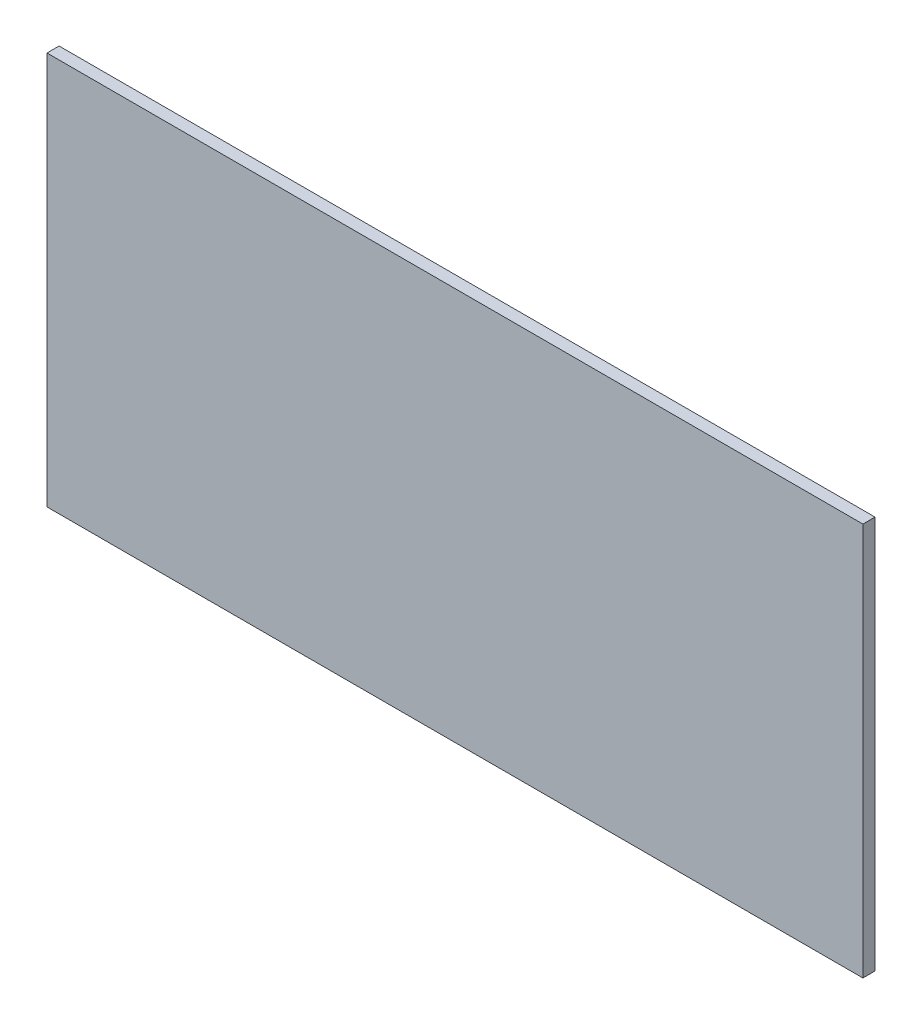
ISO-10303-21;
HEADER;
FILE_DESCRIPTION(('STEP AP214'),'2;1');
FILE_NAME('part.step','',(''),(''),'','','');
FILE_SCHEMA(('AUTOMOTIVE_DESIGN { 1 0 10303 214 1 1 1 1 }'));
ENDSEC;
DATA;
#1=APPLICATION_CONTEXT('core data for automotive mechanical design processes');
#2=APPLICATION_PROTOCOL_DEFINITION('international standard','automotive_design',2000,#1);
#3=PRODUCT_CONTEXT('',#1,'mechanical');
#4=PRODUCT('Part','Part','',(#3));
#5=PRODUCT_RELATED_PRODUCT_CATEGORY('part','',(#4));
#6=PRODUCT_DEFINITION_FORMATION('','',#4);
#7=PRODUCT_DEFINITION_CONTEXT('part definition',#1,'design');
#8=PRODUCT_DEFINITION('design','',#6,#7);
#9=PRODUCT_DEFINITION_SHAPE('','',#8);
#10=(LENGTH_UNIT() NAMED_UNIT(*) SI_UNIT(.MILLI.,.METRE.));
#11=(NAMED_UNIT(*) PLANE_ANGLE_UNIT() SI_UNIT($,.RADIAN.));
#12=(NAMED_UNIT(*) SI_UNIT($,.STERADIAN.) SOLID_ANGLE_UNIT());
#13=UNCERTAINTY_MEASURE_WITH_UNIT(LENGTH_MEASURE(1.E-05),#10,'distance_accuracy_value','');
#14=(GEOMETRIC_REPRESENTATION_CONTEXT(3) GLOBAL_UNCERTAINTY_ASSIGNED_CONTEXT((#13)) GLOBAL_UNIT_ASSIGNED_CONTEXT((#10,
#11,#12)) REPRESENTATION_CONTEXT('',''));
#15=CARTESIAN_POINT('',(0.,0.,0.));
#16=DIRECTION('',(0.,0.,1.));
#17=DIRECTION('',(1.,0.,0.));
#18=AXIS2_PLACEMENT_3D('',#15,#16,#17);
#19=CARTESIAN_POINT('',(101.,48.665,3.));
#20=DIRECTION('',(-1.,0.,0.));
#21=DIRECTION('',(0.,-1.,0.));
#22=AXIS2_PLACEMENT_3D('',#19,#20,#21);
#23=PLANE('',#22);
#24=DIRECTION('',(0.,1.,0.));
#25=VECTOR('',#24,1.);
#26=CARTESIAN_POINT('',(101.,48.665,0.));
#27=LINE('',#26,#25);
#28=CARTESIAN_POINT('',(101.,-48.665,0.));
#29=VERTEX_POINT('',#28);
#30=CARTESIAN_POINT('',(101.,48.665,0.));
#31=VERTEX_POINT('',#30);
#32=EDGE_CURVE('E102',#29,#31,#27,.T.);
#33=ORIENTED_EDGE('',*,*,#32,.T.);
#34=DIRECTION('',(0.,0.,-1.));
#35=VECTOR('',#34,1.);
#36=CARTESIAN_POINT('',(101.,48.665,3.));
#37=LINE('',#36,#35);
#38=CARTESIAN_POINT('',(101.,48.665,3.));
#39=VERTEX_POINT('',#38);
#40=EDGE_CURVE('E11',#39,#31,#37,.T.);
#41=ORIENTED_EDGE('',*,*,#40,.F.);
#42=DIRECTION('',(0.,1.,0.));
#43=VECTOR('',#42,1.);
#44=CARTESIAN_POINT('',(101.,48.665,3.));
#45=LINE('',#44,#43);
#46=CARTESIAN_POINT('',(101.,-48.665,3.));
#47=VERTEX_POINT('',#46);
#48=EDGE_CURVE('E90',#47,#39,#45,.T.);
#49=ORIENTED_EDGE('',*,*,#48,.F.);
#50=DIRECTION('',(0.,0.,-1.));
#51=VECTOR('',#50,1.);
#52=CARTESIAN_POINT('',(101.,-48.665,3.));
#53=LINE('',#52,#51);
#54=EDGE_CURVE('E98',#47,#29,#53,.T.);
#55=ORIENTED_EDGE('',*,*,#54,.T.);
#56=EDGE_LOOP('',(#33,#41,#49,#55));
#57=FACE_BOUND('',#56,.T.);
#58=ADVANCED_FACE('F39',(#57),#23,.F.);
#59=CARTESIAN_POINT('',(-101.,48.665,3.));
#60=DIRECTION('',(0.,-1.,0.));
#61=DIRECTION('',(0.,0.,-1.));
#62=AXIS2_PLACEMENT_3D('',#59,#60,#61);
#63=PLANE('',#62);
#64=DIRECTION('',(-1.,0.,0.));
#65=VECTOR('',#64,1.);
#66=CARTESIAN_POINT('',(-101.,48.665,0.));
#67=LINE('',#66,#65);
#68=CARTESIAN_POINT('',(-101.,48.665,0.));
#69=VERTEX_POINT('',#68);
#70=EDGE_CURVE('E94',#31,#69,#67,.T.);
#71=ORIENTED_EDGE('',*,*,#70,.T.);
#72=DIRECTION('',(0.,0.,-1.));
#73=VECTOR('',#72,1.);
#74=CARTESIAN_POINT('',(-101.,48.665,3.));
#75=LINE('',#74,#73);
#76=CARTESIAN_POINT('',(-101.,48.665,3.));
#77=VERTEX_POINT('',#76);
#78=EDGE_CURVE('E47',#77,#69,#75,.T.);
#79=ORIENTED_EDGE('',*,*,#78,.F.);
#80=DIRECTION('',(-1.,0.,0.));
#81=VECTOR('',#80,1.);
#82=CARTESIAN_POINT('',(-101.,48.665,3.));
#83=LINE('',#82,#81);
#84=EDGE_CURVE('E85',#39,#77,#83,.T.);
#85=ORIENTED_EDGE('',*,*,#84,.F.);
#86=ORIENTED_EDGE('',*,*,#40,.T.);
#87=EDGE_LOOP('',(#71,#79,#85,#86));
#88=FACE_BOUND('',#87,.T.);
#89=ADVANCED_FACE('F93',(#88),#63,.F.);
#90=CARTESIAN_POINT('',(-101.,48.665,3.));
#91=DIRECTION('',(1.,0.,0.));
#92=DIRECTION('',(0.,1.,0.));
#93=AXIS2_PLACEMENT_3D('',#90,#91,#92);
#94=PLANE('',#93);
#95=DIRECTION('',(0.,-1.,0.));
#96=VECTOR('',#95,1.);
#97=CARTESIAN_POINT('',(-101.,48.665,0.));
#98=LINE('',#97,#96);
#99=CARTESIAN_POINT('',(-101.,-48.665,0.));
#100=VERTEX_POINT('',#99);
#101=EDGE_CURVE('E72',#69,#100,#98,.T.);
#102=ORIENTED_EDGE('',*,*,#101,.T.);
#103=DIRECTION('',(0.,0.,-1.));
#104=VECTOR('',#103,1.);
#105=CARTESIAN_POINT('',(-101.,-48.665,3.));
#106=LINE('',#105,#104);
#107=CARTESIAN_POINT('',(-101.,-48.665,3.));
#108=VERTEX_POINT('',#107);
#109=EDGE_CURVE('E95',#108,#100,#106,.T.);
#110=ORIENTED_EDGE('',*,*,#109,.F.);
#111=DIRECTION('',(0.,-1.,0.));
#112=VECTOR('',#111,1.);
#113=CARTESIAN_POINT('',(-101.,48.665,3.));
#114=LINE('',#113,#112);
#115=EDGE_CURVE('E88',#77,#108,#114,.T.);
#116=ORIENTED_EDGE('',*,*,#115,.F.);
#117=ORIENTED_EDGE('',*,*,#78,.T.);
#118=EDGE_LOOP('',(#102,#110,#116,#117));
#119=FACE_BOUND('',#118,.T.);
#120=ADVANCED_FACE('F96',(#119),#94,.F.);
#121=CARTESIAN_POINT('',(-101.,-48.665,3.));
#122=DIRECTION('',(0.,1.,0.));
#123=DIRECTION('',(0.,0.,1.));
#124=AXIS2_PLACEMENT_3D('',#121,#122,#123);
#125=PLANE('',#124);
#126=DIRECTION('',(1.,0.,0.));
#127=VECTOR('',#126,1.);
#128=CARTESIAN_POINT('',(-101.,-48.665,0.));
#129=LINE('',#128,#127);
#130=EDGE_CURVE('E78',#100,#29,#129,.T.);
#131=ORIENTED_EDGE('',*,*,#130,.T.);
#132=ORIENTED_EDGE('',*,*,#54,.F.);
#133=DIRECTION('',(1.,0.,0.));
#134=VECTOR('',#133,1.);
#135=CARTESIAN_POINT('',(-101.,-48.665,3.));
#136=LINE('',#135,#134);
#137=EDGE_CURVE('E55',#108,#47,#136,.T.);
#138=ORIENTED_EDGE('',*,*,#137,.F.);
#139=ORIENTED_EDGE('',*,*,#109,.T.);
#140=EDGE_LOOP('',(#131,#132,#138,#139));
#141=FACE_BOUND('',#140,.T.);
#142=ADVANCED_FACE('F109',(#141),#125,.F.);
#143=CARTESIAN_POINT('',(0.,0.,3.));
#144=DIRECTION('',(0.,0.,1.));
#145=DIRECTION('',(1.,0.,0.));
#146=AXIS2_PLACEMENT_3D('',#143,#144,#145);
#147=PLANE('',#146);
#148=ORIENTED_EDGE('',*,*,#48,.T.);
#149=ORIENTED_EDGE('',*,*,#84,.T.);
#150=ORIENTED_EDGE('',*,*,#115,.T.);
#151=ORIENTED_EDGE('',*,*,#137,.T.);
#152=EDGE_LOOP('',(#148,#149,#150,#151));
#153=FACE_BOUND('',#152,.T.);
#154=ADVANCED_FACE('F86',(#153),#147,.T.);
#155=CARTESIAN_POINT('',(0.,0.,0.));
#156=DIRECTION('',(0.,0.,1.));
#157=DIRECTION('',(1.,0.,0.));
#158=AXIS2_PLACEMENT_3D('',#155,#156,#157);
#159=PLANE('',#158);
#160=ORIENTED_EDGE('',*,*,#32,.F.);
#161=ORIENTED_EDGE('',*,*,#130,.F.);
#162=ORIENTED_EDGE('',*,*,#101,.F.);
#163=ORIENTED_EDGE('',*,*,#70,.F.);
#164=EDGE_LOOP('',(#160,#161,#162,#163));
#165=FACE_BOUND('',#164,.T.);
#166=ADVANCED_FACE('F112',(#165),#159,.F.);
#167=CLOSED_SHELL('',(#58,#89,#120,#142,#154,#166));
#168=MANIFOLD_SOLID_BREP('B2',#167);
#169=ADVANCED_BREP_SHAPE_REPRESENTATION('',(#18,#168),#14);
#170=SHAPE_DEFINITION_REPRESENTATION(#9,#169);
ENDSEC;
END-ISO-10303-21;
